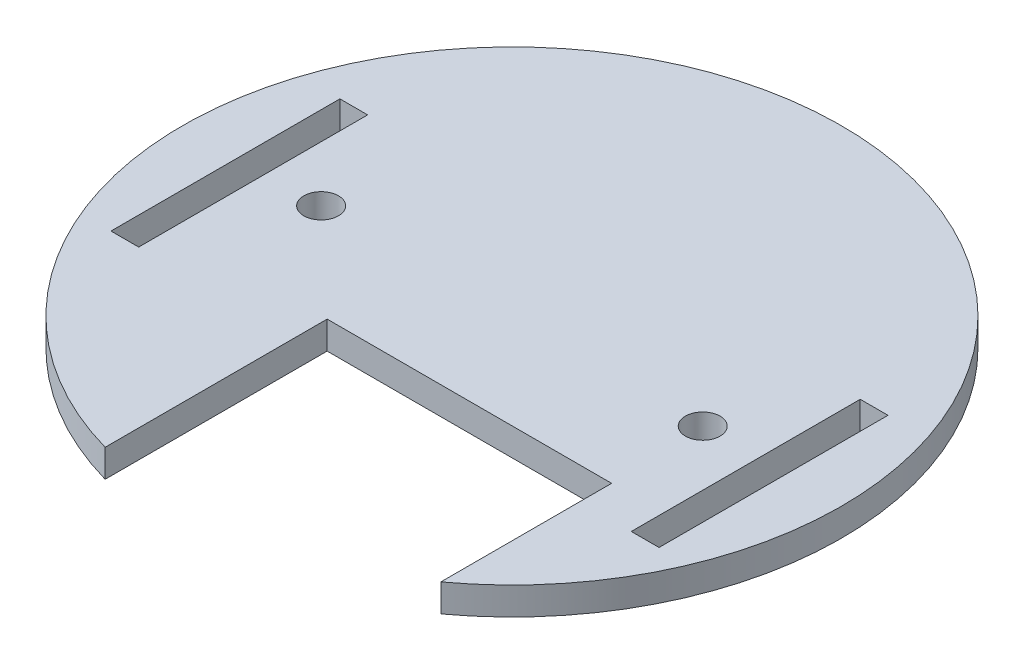
ISO-10303-21;
HEADER;
FILE_DESCRIPTION(('STEP AP214'),'2;1');
FILE_NAME('part.step','',(''),(''),'','','');
FILE_SCHEMA(('AUTOMOTIVE_DESIGN { 1 0 10303 214 1 1 1 1 }'));
ENDSEC;
DATA;
#1=APPLICATION_CONTEXT('core data for automotive mechanical design processes');
#2=APPLICATION_PROTOCOL_DEFINITION('international standard','automotive_design',2000,#1);
#3=PRODUCT_CONTEXT('',#1,'mechanical');
#4=PRODUCT('Part','Part','',(#3));
#5=PRODUCT_RELATED_PRODUCT_CATEGORY('part','',(#4));
#6=PRODUCT_DEFINITION_FORMATION('','',#4);
#7=PRODUCT_DEFINITION_CONTEXT('part definition',#1,'design');
#8=PRODUCT_DEFINITION('design','',#6,#7);
#9=PRODUCT_DEFINITION_SHAPE('','',#8);
#10=(LENGTH_UNIT() NAMED_UNIT(*) SI_UNIT(.MILLI.,.METRE.));
#11=(NAMED_UNIT(*) PLANE_ANGLE_UNIT() SI_UNIT($,.RADIAN.));
#12=(NAMED_UNIT(*) SI_UNIT($,.STERADIAN.) SOLID_ANGLE_UNIT());
#13=UNCERTAINTY_MEASURE_WITH_UNIT(LENGTH_MEASURE(1.E-05),#10,'distance_accuracy_value','');
#14=(GEOMETRIC_REPRESENTATION_CONTEXT(3) GLOBAL_UNCERTAINTY_ASSIGNED_CONTEXT((#13)) GLOBAL_UNIT_ASSIGNED_CONTEXT((#10,
#11,#12)) REPRESENTATION_CONTEXT('',''));
#15=CARTESIAN_POINT('',(0.,0.,0.));
#16=DIRECTION('',(0.,0.,1.));
#17=DIRECTION('',(1.,0.,0.));
#18=AXIS2_PLACEMENT_3D('',#15,#16,#17);
#19=CARTESIAN_POINT('',(0.,4.,0.));
#20=DIRECTION('',(0.,1.,0.));
#21=DIRECTION('',(0.,0.,1.));
#22=AXIS2_PLACEMENT_3D('',#19,#20,#21);
#23=PLANE('',#22);
#24=CARTESIAN_POINT('',(-27.5,4.,0.));
#25=DIRECTION('',(0.,1.,0.));
#26=DIRECTION('',(0.,0.,1.));
#27=AXIS2_PLACEMENT_3D('',#24,#25,#26);
#28=CIRCLE('',#27,2.5);
#29=CARTESIAN_POINT('',(-27.5,4.,2.5));
#30=VERTEX_POINT('',#29);
#31=EDGE_CURVE('E161',#30,#30,#28,.T.);
#32=ORIENTED_EDGE('',*,*,#31,.F.);
#33=EDGE_LOOP('',(#32));
#34=FACE_BOUND('',#33,.T.);
#35=CARTESIAN_POINT('',(0.,4.,0.));
#36=DIRECTION('',(0.,1.,0.));
#37=DIRECTION('',(0.,0.,1.));
#38=AXIS2_PLACEMENT_3D('',#35,#36,#37);
#39=CIRCLE('',#38,47.5);
#40=CARTESIAN_POINT('',(28.0710045570751,4.,38.3179945085422));
#41=VERTEX_POINT('',#40);
#42=CARTESIAN_POINT('',(-12.9289954429249,4.,45.7065758599004));
#43=VERTEX_POINT('',#42);
#44=EDGE_CURVE('E196',#41,#43,#39,.T.);
#45=ORIENTED_EDGE('',*,*,#44,.T.);
#46=DIRECTION('',(0.,0.,-1.));
#47=VECTOR('',#46,1.);
#48=CARTESIAN_POINT('',(-12.9289954429249,4.,45.7065758599004));
#49=LINE('',#48,#47);
#50=CARTESIAN_POINT('',(-12.9289954429249,4.,13.7065758599004));
#51=VERTEX_POINT('',#50);
#52=EDGE_CURVE('E199',#43,#51,#49,.T.);
#53=ORIENTED_EDGE('',*,*,#52,.T.);
#54=DIRECTION('',(1.,0.,0.));
#55=VECTOR('',#54,1.);
#56=CARTESIAN_POINT('',(-12.9289954429249,4.,13.7065758599004));
#57=LINE('',#56,#55);
#58=CARTESIAN_POINT('',(28.0710045570751,4.,13.7065758599004));
#59=VERTEX_POINT('',#58);
#60=EDGE_CURVE('E202',#51,#59,#57,.T.);
#61=ORIENTED_EDGE('',*,*,#60,.T.);
#62=DIRECTION('',(0.,0.,1.));
#63=VECTOR('',#62,1.);
#64=CARTESIAN_POINT('',(28.0710045570751,4.,13.7065758599004));
#65=LINE('',#64,#63);
#66=EDGE_CURVE('E204',#59,#41,#65,.T.);
#67=ORIENTED_EDGE('',*,*,#66,.T.);
#68=EDGE_LOOP('',(#45,#53,#61,#67));
#69=FACE_BOUND('',#68,.T.);
#70=DIRECTION('',(-1.,0.,0.));
#71=VECTOR('',#70,1.);
#72=CARTESIAN_POINT('',(-39.5,4.,-14.7013410731334));
#73=LINE('',#72,#71);
#74=CARTESIAN_POINT('',(-35.5,4.,-14.7013410731334));
#75=VERTEX_POINT('',#74);
#76=CARTESIAN_POINT('',(-39.5,4.,-14.7013410731334));
#77=VERTEX_POINT('',#76);
#78=EDGE_CURVE('E169',#75,#77,#73,.T.);
#79=ORIENTED_EDGE('',*,*,#78,.F.);
#80=DIRECTION('',(0.,0.,-1.));
#81=VECTOR('',#80,1.);
#82=CARTESIAN_POINT('',(-35.5,4.,18.2986589268666));
#83=LINE('',#82,#81);
#84=CARTESIAN_POINT('',(-35.5,4.,18.2986589268666));
#85=VERTEX_POINT('',#84);
#86=EDGE_CURVE('E167',#85,#75,#83,.T.);
#87=ORIENTED_EDGE('',*,*,#86,.F.);
#88=DIRECTION('',(1.,0.,0.));
#89=VECTOR('',#88,1.);
#90=CARTESIAN_POINT('',(-35.5,4.,18.2986589268666));
#91=LINE('',#90,#89);
#92=CARTESIAN_POINT('',(-39.5,4.,18.2986589268666));
#93=VERTEX_POINT('',#92);
#94=EDGE_CURVE('E175',#93,#85,#91,.T.);
#95=ORIENTED_EDGE('',*,*,#94,.F.);
#96=DIRECTION('',(0.,0.,1.));
#97=VECTOR('',#96,1.);
#98=CARTESIAN_POINT('',(-39.5,4.,18.2986589268666));
#99=LINE('',#98,#97);
#100=EDGE_CURVE('E172',#77,#93,#99,.T.);
#101=ORIENTED_EDGE('',*,*,#100,.F.);
#102=EDGE_LOOP('',(#79,#87,#95,#101));
#103=FACE_BOUND('',#102,.T.);
#104=CARTESIAN_POINT('',(27.5,4.,0.));
#105=DIRECTION('',(0.,1.,0.));
#106=DIRECTION('',(0.,0.,-1.));
#107=AXIS2_PLACEMENT_3D('',#104,#105,#106);
#108=CIRCLE('',#107,2.5);
#109=CARTESIAN_POINT('',(27.5,4.,-2.50000000000001));
#110=VERTEX_POINT('',#109);
#111=EDGE_CURVE('E155',#110,#110,#108,.T.);
#112=ORIENTED_EDGE('',*,*,#111,.F.);
#113=EDGE_LOOP('',(#112));
#114=FACE_BOUND('',#113,.T.);
#115=DIRECTION('',(0.,0.,-1.));
#116=VECTOR('',#115,1.);
#117=CARTESIAN_POINT('',(39.5,4.,18.2986589268666));
#118=LINE('',#117,#116);
#119=CARTESIAN_POINT('',(39.5,4.,18.2986589268666));
#120=VERTEX_POINT('',#119);
#121=CARTESIAN_POINT('',(39.5,4.,-14.7013410731334));
#122=VERTEX_POINT('',#121);
#123=EDGE_CURVE('E137',#120,#122,#118,.T.);
#124=ORIENTED_EDGE('',*,*,#123,.F.);
#125=DIRECTION('',(1.,0.,0.));
#126=VECTOR('',#125,1.);
#127=CARTESIAN_POINT('',(35.5,4.,18.2986589268666));
#128=LINE('',#127,#126);
#129=CARTESIAN_POINT('',(35.5,4.,18.2986589268666));
#130=VERTEX_POINT('',#129);
#131=EDGE_CURVE('E124',#130,#120,#128,.T.);
#132=ORIENTED_EDGE('',*,*,#131,.F.);
#133=DIRECTION('',(0.,0.,1.));
#134=VECTOR('',#133,1.);
#135=CARTESIAN_POINT('',(35.5,4.,18.2986589268666));
#136=LINE('',#135,#134);
#137=CARTESIAN_POINT('',(35.5,4.,-14.7013410731334));
#138=VERTEX_POINT('',#137);
#139=EDGE_CURVE('E119',#138,#130,#136,.T.);
#140=ORIENTED_EDGE('',*,*,#139,.F.);
#141=DIRECTION('',(-1.,0.,0.));
#142=VECTOR('',#141,1.);
#143=CARTESIAN_POINT('',(35.5,4.,-14.7013410731334));
#144=LINE('',#143,#142);
#145=EDGE_CURVE('E139',#122,#138,#144,.T.);
#146=ORIENTED_EDGE('',*,*,#145,.F.);
#147=EDGE_LOOP('',(#124,#132,#140,#146));
#148=FACE_BOUND('',#147,.T.);
#149=ADVANCED_FACE('F33',(#34,#69,#103,#114,#148),#23,.T.);
#150=CARTESIAN_POINT('',(0.,0.,0.));
#151=DIRECTION('',(0.,1.,0.));
#152=DIRECTION('',(0.,0.,1.));
#153=AXIS2_PLACEMENT_3D('',#150,#151,#152);
#154=PLANE('',#153);
#155=CARTESIAN_POINT('',(27.5,0.,0.));
#156=DIRECTION('',(0.,1.,0.));
#157=DIRECTION('',(0.,0.,-1.));
#158=AXIS2_PLACEMENT_3D('',#155,#156,#157);
#159=CIRCLE('',#158,2.5);
#160=CARTESIAN_POINT('',(27.5,0.,-2.50000000000001));
#161=VERTEX_POINT('',#160);
#162=EDGE_CURVE('E133',#161,#161,#159,.T.);
#163=ORIENTED_EDGE('',*,*,#162,.T.);
#164=EDGE_LOOP('',(#163));
#165=FACE_BOUND('',#164,.T.);
#166=CARTESIAN_POINT('',(-27.5,0.,0.));
#167=DIRECTION('',(0.,1.,0.));
#168=DIRECTION('',(0.,0.,1.));
#169=AXIS2_PLACEMENT_3D('',#166,#167,#168);
#170=CIRCLE('',#169,2.5);
#171=CARTESIAN_POINT('',(-27.5,0.,2.5));
#172=VERTEX_POINT('',#171);
#173=EDGE_CURVE('E158',#172,#172,#170,.T.);
#174=ORIENTED_EDGE('',*,*,#173,.T.);
#175=EDGE_LOOP('',(#174));
#176=FACE_BOUND('',#175,.T.);
#177=DIRECTION('',(0.,0.,-1.));
#178=VECTOR('',#177,1.);
#179=CARTESIAN_POINT('',(-35.5,0.,-9.1514294287429));
#180=LINE('',#179,#178);
#181=CARTESIAN_POINT('',(-35.5,0.,18.2986589268666));
#182=VERTEX_POINT('',#181);
#183=CARTESIAN_POINT('',(-35.5,0.,-14.7013410731334));
#184=VERTEX_POINT('',#183);
#185=EDGE_CURVE('E164',#182,#184,#180,.T.);
#186=ORIENTED_EDGE('',*,*,#185,.T.);
#187=DIRECTION('',(-1.,0.,0.));
#188=VECTOR('',#187,1.);
#189=CARTESIAN_POINT('',(-39.5,0.,-14.7013410731334));
#190=LINE('',#189,#188);
#191=CARTESIAN_POINT('',(-39.5,0.,-14.7013410731334));
#192=VERTEX_POINT('',#191);
#193=EDGE_CURVE('E180',#184,#192,#190,.T.);
#194=ORIENTED_EDGE('',*,*,#193,.T.);
#195=DIRECTION('',(0.,0.,1.));
#196=VECTOR('',#195,1.);
#197=CARTESIAN_POINT('',(-39.5,0.,18.2986589268666));
#198=LINE('',#197,#196);
#199=CARTESIAN_POINT('',(-39.5,0.,18.2986589268666));
#200=VERTEX_POINT('',#199);
#201=EDGE_CURVE('E183',#192,#200,#198,.T.);
#202=ORIENTED_EDGE('',*,*,#201,.T.);
#203=DIRECTION('',(1.,0.,0.));
#204=VECTOR('',#203,1.);
#205=CARTESIAN_POINT('',(-35.5,0.,18.2986589268666));
#206=LINE('',#205,#204);
#207=EDGE_CURVE('E170',#200,#182,#206,.T.);
#208=ORIENTED_EDGE('',*,*,#207,.T.);
#209=EDGE_LOOP('',(#186,#194,#202,#208));
#210=FACE_BOUND('',#209,.T.);
#211=CARTESIAN_POINT('',(0.,0.,0.));
#212=DIRECTION('',(0.,1.,0.));
#213=DIRECTION('',(0.,0.,1.));
#214=AXIS2_PLACEMENT_3D('',#211,#212,#213);
#215=CIRCLE('',#214,47.5);
#216=CARTESIAN_POINT('',(28.0710045570751,0.,38.3179945085422));
#217=VERTEX_POINT('',#216);
#218=CARTESIAN_POINT('',(-12.9289954429249,0.,45.7065758599004));
#219=VERTEX_POINT('',#218);
#220=EDGE_CURVE('E195',#217,#219,#215,.T.);
#221=ORIENTED_EDGE('',*,*,#220,.F.);
#222=DIRECTION('',(0.,0.,1.));
#223=VECTOR('',#222,1.);
#224=CARTESIAN_POINT('',(28.0710045570751,0.,13.7065758599004));
#225=LINE('',#224,#223);
#226=CARTESIAN_POINT('',(28.0710045570751,0.,13.7065758599004));
#227=VERTEX_POINT('',#226);
#228=EDGE_CURVE('E200',#227,#217,#225,.T.);
#229=ORIENTED_EDGE('',*,*,#228,.F.);
#230=DIRECTION('',(1.,0.,0.));
#231=VECTOR('',#230,1.);
#232=CARTESIAN_POINT('',(-12.9289954429249,0.,13.7065758599004));
#233=LINE('',#232,#231);
#234=CARTESIAN_POINT('',(-12.9289954429249,0.,13.7065758599004));
#235=VERTEX_POINT('',#234);
#236=EDGE_CURVE('E211',#235,#227,#233,.T.);
#237=ORIENTED_EDGE('',*,*,#236,.F.);
#238=DIRECTION('',(0.,0.,-1.));
#239=VECTOR('',#238,1.);
#240=CARTESIAN_POINT('',(-12.9289954429249,0.,45.7065758599004));
#241=LINE('',#240,#239);
#242=EDGE_CURVE('E209',#219,#235,#241,.T.);
#243=ORIENTED_EDGE('',*,*,#242,.F.);
#244=EDGE_LOOP('',(#221,#229,#237,#243));
#245=FACE_BOUND('',#244,.T.);
#246=DIRECTION('',(1.,0.,0.));
#247=VECTOR('',#246,1.);
#248=CARTESIAN_POINT('',(35.5,0.,18.2986589268666));
#249=LINE('',#248,#247);
#250=CARTESIAN_POINT('',(35.5000000000002,0.,18.2986589268666));
#251=VERTEX_POINT('',#250);
#252=CARTESIAN_POINT('',(39.5,0.,18.2986589268666));
#253=VERTEX_POINT('',#252);
#254=EDGE_CURVE('E131',#251,#253,#249,.T.);
#255=ORIENTED_EDGE('',*,*,#254,.T.);
#256=DIRECTION('',(0.,0.,-1.));
#257=VECTOR('',#256,1.);
#258=CARTESIAN_POINT('',(39.5,0.,18.2986589268666));
#259=LINE('',#258,#257);
#260=CARTESIAN_POINT('',(39.5,0.,-14.7013410731334));
#261=VERTEX_POINT('',#260);
#262=EDGE_CURVE('E144',#253,#261,#259,.T.);
#263=ORIENTED_EDGE('',*,*,#262,.T.);
#264=DIRECTION('',(-1.,0.,0.));
#265=VECTOR('',#264,1.);
#266=CARTESIAN_POINT('',(35.5,0.,-14.7013410731334));
#267=LINE('',#266,#265);
#268=CARTESIAN_POINT('',(35.5,0.,-14.7013410731334));
#269=VERTEX_POINT('',#268);
#270=EDGE_CURVE('E147',#261,#269,#267,.T.);
#271=ORIENTED_EDGE('',*,*,#270,.T.);
#272=DIRECTION('',(0.,0.,1.));
#273=VECTOR('',#272,1.);
#274=CARTESIAN_POINT('',(35.5,0.,-9.15142942874291));
#275=LINE('',#274,#273);
#276=EDGE_CURVE('E125',#269,#251,#275,.T.);
#277=ORIENTED_EDGE('',*,*,#276,.T.);
#278=EDGE_LOOP('',(#255,#263,#271,#277));
#279=FACE_BOUND('',#278,.T.);
#280=ADVANCED_FACE('F229',(#165,#176,#210,#245,#279),#154,.F.);
#281=CARTESIAN_POINT('',(0.,4.,0.));
#282=DIRECTION('',(0.,-1.,0.));
#283=DIRECTION('',(0.,0.,-1.));
#284=AXIS2_PLACEMENT_3D('',#281,#282,#283);
#285=CYLINDRICAL_SURFACE('',#284,47.5);
#286=ORIENTED_EDGE('',*,*,#220,.T.);
#287=DIRECTION('',(0.,-1.,0.));
#288=VECTOR('',#287,1.);
#289=CARTESIAN_POINT('',(-12.9289954429249,4.,45.7065758599004));
#290=LINE('',#289,#288);
#291=EDGE_CURVE('E11',#43,#219,#290,.T.);
#292=ORIENTED_EDGE('',*,*,#291,.F.);
#293=ORIENTED_EDGE('',*,*,#44,.F.);
#294=DIRECTION('',(0.,-1.,0.));
#295=VECTOR('',#294,1.);
#296=CARTESIAN_POINT('',(28.0710045570751,4.,38.3179945085422));
#297=LINE('',#296,#295);
#298=EDGE_CURVE('E206',#41,#217,#297,.T.);
#299=ORIENTED_EDGE('',*,*,#298,.T.);
#300=EDGE_LOOP('',(#286,#292,#293,#299));
#301=FACE_BOUND('',#300,.T.);
#302=ADVANCED_FACE('F35',(#301),#285,.T.);
#303=CARTESIAN_POINT('',(-12.9289954429249,4.,45.7065758599004));
#304=DIRECTION('',(-1.,0.,0.));
#305=DIRECTION('',(0.,0.,1.));
#306=AXIS2_PLACEMENT_3D('',#303,#304,#305);
#307=PLANE('',#306);
#308=ORIENTED_EDGE('',*,*,#242,.T.);
#309=DIRECTION('',(0.,-1.,0.));
#310=VECTOR('',#309,1.);
#311=CARTESIAN_POINT('',(-12.9289954429249,4.,13.7065758599004));
#312=LINE('',#311,#310);
#313=EDGE_CURVE('E41',#51,#235,#312,.T.);
#314=ORIENTED_EDGE('',*,*,#313,.F.);
#315=ORIENTED_EDGE('',*,*,#52,.F.);
#316=ORIENTED_EDGE('',*,*,#291,.T.);
#317=EDGE_LOOP('',(#308,#314,#315,#316));
#318=FACE_BOUND('',#317,.T.);
#319=ADVANCED_FACE('F240',(#318),#307,.F.);
#320=CARTESIAN_POINT('',(-12.9289954429249,4.,13.7065758599004));
#321=DIRECTION('',(0.,0.,-1.));
#322=DIRECTION('',(-1.,0.,0.));
#323=AXIS2_PLACEMENT_3D('',#320,#321,#322);
#324=PLANE('',#323);
#325=ORIENTED_EDGE('',*,*,#236,.T.);
#326=DIRECTION('',(0.,-1.,0.));
#327=VECTOR('',#326,1.);
#328=CARTESIAN_POINT('',(28.0710045570751,4.,13.7065758599004));
#329=LINE('',#328,#327);
#330=EDGE_CURVE('E216',#59,#227,#329,.T.);
#331=ORIENTED_EDGE('',*,*,#330,.F.);
#332=ORIENTED_EDGE('',*,*,#60,.F.);
#333=ORIENTED_EDGE('',*,*,#313,.T.);
#334=EDGE_LOOP('',(#325,#331,#332,#333));
#335=FACE_BOUND('',#334,.T.);
#336=ADVANCED_FACE('F223',(#335),#324,.F.);
#337=CARTESIAN_POINT('',(28.0710045570751,4.,13.7065758599004));
#338=DIRECTION('',(1.,0.,0.));
#339=DIRECTION('',(0.,0.,-1.));
#340=AXIS2_PLACEMENT_3D('',#337,#338,#339);
#341=PLANE('',#340);
#342=ORIENTED_EDGE('',*,*,#228,.T.);
#343=ORIENTED_EDGE('',*,*,#298,.F.);
#344=ORIENTED_EDGE('',*,*,#66,.F.);
#345=ORIENTED_EDGE('',*,*,#330,.T.);
#346=EDGE_LOOP('',(#342,#343,#344,#345));
#347=FACE_BOUND('',#346,.T.);
#348=ADVANCED_FACE('F233',(#347),#341,.F.);
#349=CARTESIAN_POINT('',(-35.5,4.,-9.1514294287429));
#350=DIRECTION('',(-1.,0.,0.));
#351=DIRECTION('',(0.,0.,1.));
#352=AXIS2_PLACEMENT_3D('',#349,#350,#351);
#353=PLANE('',#352);
#354=ORIENTED_EDGE('',*,*,#185,.F.);
#355=DIRECTION('',(0.,-1.,0.));
#356=VECTOR('',#355,1.);
#357=CARTESIAN_POINT('',(-35.5,4.,18.2986589268666));
#358=LINE('',#357,#356);
#359=EDGE_CURVE('E177',#85,#182,#358,.T.);
#360=ORIENTED_EDGE('',*,*,#359,.F.);
#361=ORIENTED_EDGE('',*,*,#86,.T.);
#362=DIRECTION('',(0.,-1.,0.));
#363=VECTOR('',#362,1.);
#364=CARTESIAN_POINT('',(-35.5,4.,-14.7013410731334));
#365=LINE('',#364,#363);
#366=EDGE_CURVE('E193',#75,#184,#365,.T.);
#367=ORIENTED_EDGE('',*,*,#366,.T.);
#368=EDGE_LOOP('',(#354,#360,#361,#367));
#369=FACE_BOUND('',#368,.T.);
#370=ADVANCED_FACE('F257',(#369),#353,.T.);
#371=CARTESIAN_POINT('',(-39.5,4.,-14.7013410731334));
#372=DIRECTION('',(0.,0.,1.));
#373=DIRECTION('',(1.,0.,0.));
#374=AXIS2_PLACEMENT_3D('',#371,#372,#373);
#375=PLANE('',#374);
#376=ORIENTED_EDGE('',*,*,#193,.F.);
#377=ORIENTED_EDGE('',*,*,#366,.F.);
#378=ORIENTED_EDGE('',*,*,#78,.T.);
#379=DIRECTION('',(0.,-1.,0.));
#380=VECTOR('',#379,1.);
#381=CARTESIAN_POINT('',(-39.5,4.,-14.7013410731334));
#382=LINE('',#381,#380);
#383=EDGE_CURVE('E191',#77,#192,#382,.T.);
#384=ORIENTED_EDGE('',*,*,#383,.T.);
#385=EDGE_LOOP('',(#376,#377,#378,#384));
#386=FACE_BOUND('',#385,.T.);
#387=ADVANCED_FACE('F264',(#386),#375,.T.);
#388=CARTESIAN_POINT('',(-39.5,4.,18.2986589268666));
#389=DIRECTION('',(1.,0.,0.));
#390=DIRECTION('',(0.,0.,-1.));
#391=AXIS2_PLACEMENT_3D('',#388,#389,#390);
#392=PLANE('',#391);
#393=ORIENTED_EDGE('',*,*,#201,.F.);
#394=ORIENTED_EDGE('',*,*,#383,.F.);
#395=ORIENTED_EDGE('',*,*,#100,.T.);
#396=DIRECTION('',(0.,-1.,0.));
#397=VECTOR('',#396,1.);
#398=CARTESIAN_POINT('',(-39.5,4.,18.2986589268666));
#399=LINE('',#398,#397);
#400=EDGE_CURVE('E189',#93,#200,#399,.T.);
#401=ORIENTED_EDGE('',*,*,#400,.T.);
#402=EDGE_LOOP('',(#393,#394,#395,#401));
#403=FACE_BOUND('',#402,.T.);
#404=ADVANCED_FACE('F269',(#403),#392,.T.);
#405=CARTESIAN_POINT('',(-35.5,4.,18.2986589268666));
#406=DIRECTION('',(0.,0.,-1.));
#407=DIRECTION('',(-1.,0.,0.));
#408=AXIS2_PLACEMENT_3D('',#405,#406,#407);
#409=PLANE('',#408);
#410=ORIENTED_EDGE('',*,*,#207,.F.);
#411=ORIENTED_EDGE('',*,*,#400,.F.);
#412=ORIENTED_EDGE('',*,*,#94,.T.);
#413=ORIENTED_EDGE('',*,*,#359,.T.);
#414=EDGE_LOOP('',(#410,#411,#412,#413));
#415=FACE_BOUND('',#414,.T.);
#416=ADVANCED_FACE('F280',(#415),#409,.T.);
#417=CARTESIAN_POINT('',(-27.5,4.,0.));
#418=DIRECTION('',(0.,-1.,0.));
#419=DIRECTION('',(0.,0.,-1.));
#420=AXIS2_PLACEMENT_3D('',#417,#418,#419);
#421=CYLINDRICAL_SURFACE('',#420,2.5);
#422=ORIENTED_EDGE('',*,*,#31,.T.);
#423=EDGE_LOOP('',(#422));
#424=FACE_BOUND('',#423,.T.);
#425=ORIENTED_EDGE('',*,*,#173,.F.);
#426=EDGE_LOOP('',(#425));
#427=FACE_BOUND('',#426,.T.);
#428=ADVANCED_FACE('F292',(#424,#427),#421,.F.);
#429=CARTESIAN_POINT('',(27.5,4.,0.));
#430=DIRECTION('',(0.,-1.,0.));
#431=DIRECTION('',(0.,0.,-1.));
#432=AXIS2_PLACEMENT_3D('',#429,#430,#431);
#433=CYLINDRICAL_SURFACE('',#432,2.5);
#434=ORIENTED_EDGE('',*,*,#111,.T.);
#435=EDGE_LOOP('',(#434));
#436=FACE_BOUND('',#435,.T.);
#437=ORIENTED_EDGE('',*,*,#162,.F.);
#438=EDGE_LOOP('',(#437));
#439=FACE_BOUND('',#438,.T.);
#440=ADVANCED_FACE('F297',(#436,#439),#433,.F.);
#441=CARTESIAN_POINT('',(35.5,4.,18.2986589268666));
#442=DIRECTION('',(0.,0.,-1.));
#443=DIRECTION('',(-1.,0.,0.));
#444=AXIS2_PLACEMENT_3D('',#441,#442,#443);
#445=PLANE('',#444);
#446=ORIENTED_EDGE('',*,*,#254,.F.);
#447=DIRECTION('',(0.,-1.,0.));
#448=VECTOR('',#447,1.);
#449=CARTESIAN_POINT('',(35.5,4.,18.2986589268666));
#450=LINE('',#449,#448);
#451=EDGE_CURVE('E53',#130,#251,#450,.T.);
#452=ORIENTED_EDGE('',*,*,#451,.F.);
#453=ORIENTED_EDGE('',*,*,#131,.T.);
#454=DIRECTION('',(0.,-1.,0.));
#455=VECTOR('',#454,1.);
#456=CARTESIAN_POINT('',(39.5,4.,18.2986589268666));
#457=LINE('',#456,#455);
#458=EDGE_CURVE('E134',#120,#253,#457,.T.);
#459=ORIENTED_EDGE('',*,*,#458,.T.);
#460=EDGE_LOOP('',(#446,#452,#453,#459));
#461=FACE_BOUND('',#460,.T.);
#462=ADVANCED_FACE('F128',(#461),#445,.T.);
#463=CARTESIAN_POINT('',(39.5,4.,18.2986589268666));
#464=DIRECTION('',(-1.,0.,0.));
#465=DIRECTION('',(0.,0.,1.));
#466=AXIS2_PLACEMENT_3D('',#463,#464,#465);
#467=PLANE('',#466);
#468=ORIENTED_EDGE('',*,*,#262,.F.);
#469=ORIENTED_EDGE('',*,*,#458,.F.);
#470=ORIENTED_EDGE('',*,*,#123,.T.);
#471=DIRECTION('',(0.,-1.,0.));
#472=VECTOR('',#471,1.);
#473=CARTESIAN_POINT('',(39.5,4.,-14.7013410731334));
#474=LINE('',#473,#472);
#475=EDGE_CURVE('E152',#122,#261,#474,.T.);
#476=ORIENTED_EDGE('',*,*,#475,.T.);
#477=EDGE_LOOP('',(#468,#469,#470,#476));
#478=FACE_BOUND('',#477,.T.);
#479=ADVANCED_FACE('F304',(#478),#467,.T.);
#480=CARTESIAN_POINT('',(35.5,4.,-14.7013410731334));
#481=DIRECTION('',(0.,0.,1.));
#482=DIRECTION('',(1.,0.,0.));
#483=AXIS2_PLACEMENT_3D('',#480,#481,#482);
#484=PLANE('',#483);
#485=ORIENTED_EDGE('',*,*,#270,.F.);
#486=ORIENTED_EDGE('',*,*,#475,.F.);
#487=ORIENTED_EDGE('',*,*,#145,.T.);
#488=DIRECTION('',(0.,-1.,0.));
#489=VECTOR('',#488,1.);
#490=CARTESIAN_POINT('',(35.5,4.,-14.7013410731334));
#491=LINE('',#490,#489);
#492=EDGE_CURVE('E48',#138,#269,#491,.T.);
#493=ORIENTED_EDGE('',*,*,#492,.T.);
#494=EDGE_LOOP('',(#485,#486,#487,#493));
#495=FACE_BOUND('',#494,.T.);
#496=ADVANCED_FACE('F307',(#495),#484,.T.);
#497=CARTESIAN_POINT('',(35.5,4.,-9.15142942874291));
#498=DIRECTION('',(1.,0.,0.));
#499=DIRECTION('',(0.,0.,-1.));
#500=AXIS2_PLACEMENT_3D('',#497,#498,#499);
#501=PLANE('',#500);
#502=ORIENTED_EDGE('',*,*,#276,.F.);
#503=ORIENTED_EDGE('',*,*,#492,.F.);
#504=ORIENTED_EDGE('',*,*,#139,.T.);
#505=ORIENTED_EDGE('',*,*,#451,.T.);
#506=EDGE_LOOP('',(#502,#503,#504,#505));
#507=FACE_BOUND('',#506,.T.);
#508=ADVANCED_FACE('F120',(#507),#501,.T.);
#509=CLOSED_SHELL('',(#149,#280,#302,#319,#336,#348,#370,#387,#404,#416,#428,#440,#462,#479,
#496,#508));
#510=MANIFOLD_SOLID_BREP('B2',#509);
#511=ADVANCED_BREP_SHAPE_REPRESENTATION('',(#18,#510),#14);
#512=SHAPE_DEFINITION_REPRESENTATION(#9,#511);
ENDSEC;
END-ISO-10303-21;
